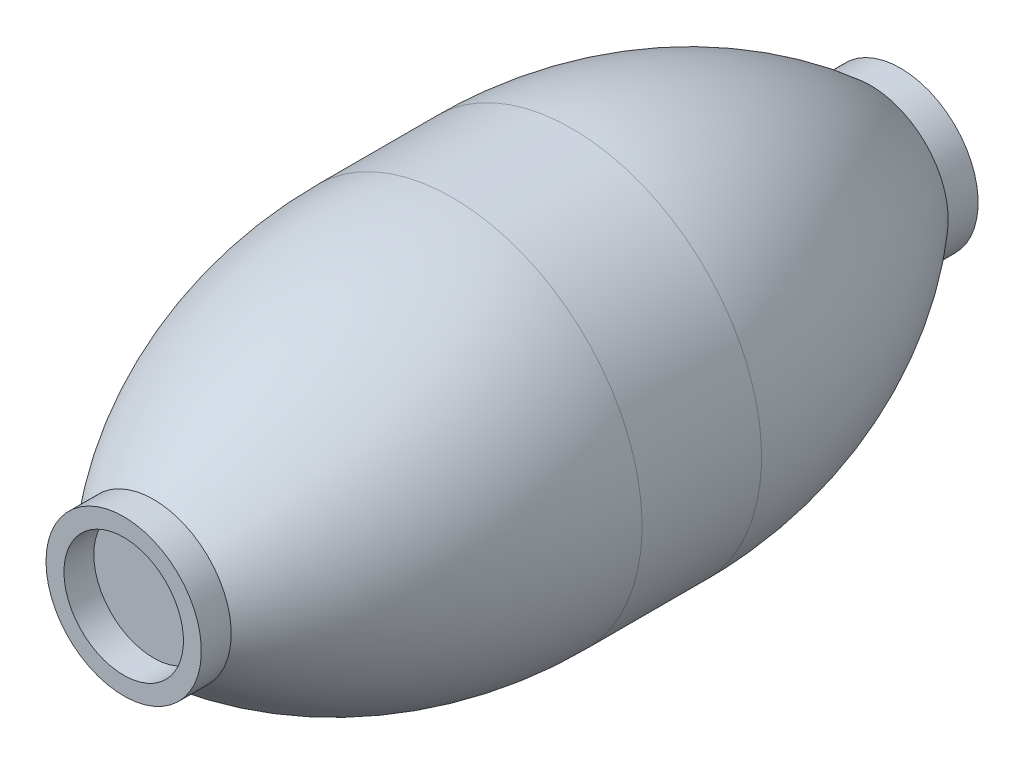
ISO-10303-21;
HEADER;
FILE_DESCRIPTION(('STEP AP214'),'2;1');
FILE_NAME('part.step','',(''),(''),'','','');
FILE_SCHEMA(('AUTOMOTIVE_DESIGN { 1 0 10303 214 1 1 1 1 }'));
ENDSEC;
DATA;
#1=APPLICATION_CONTEXT('core data for automotive mechanical design processes');
#2=APPLICATION_PROTOCOL_DEFINITION('international standard','automotive_design',2000,#1);
#3=PRODUCT_CONTEXT('',#1,'mechanical');
#4=PRODUCT('Part','Part','',(#3));
#5=PRODUCT_RELATED_PRODUCT_CATEGORY('part','',(#4));
#6=PRODUCT_DEFINITION_FORMATION('','',#4);
#7=PRODUCT_DEFINITION_CONTEXT('part definition',#1,'design');
#8=PRODUCT_DEFINITION('design','',#6,#7);
#9=PRODUCT_DEFINITION_SHAPE('','',#8);
#10=(LENGTH_UNIT() NAMED_UNIT(*) SI_UNIT(.MILLI.,.METRE.));
#11=(NAMED_UNIT(*) PLANE_ANGLE_UNIT() SI_UNIT($,.RADIAN.));
#12=(NAMED_UNIT(*) SI_UNIT($,.STERADIAN.) SOLID_ANGLE_UNIT());
#13=UNCERTAINTY_MEASURE_WITH_UNIT(LENGTH_MEASURE(1.E-05),#10,'distance_accuracy_value','');
#14=(GEOMETRIC_REPRESENTATION_CONTEXT(3) GLOBAL_UNCERTAINTY_ASSIGNED_CONTEXT((#13)) GLOBAL_UNIT_ASSIGNED_CONTEXT((#10,
#11,#12)) REPRESENTATION_CONTEXT('',''));
#15=CARTESIAN_POINT('',(0.,0.,0.));
#16=DIRECTION('',(0.,0.,1.));
#17=DIRECTION('',(1.,0.,0.));
#18=AXIS2_PLACEMENT_3D('',#15,#16,#17);
#19=CARTESIAN_POINT('',(-20.,0.,-130.));
#20=DIRECTION('',(0.,0.,-1.));
#21=DIRECTION('',(-1.,0.,0.));
#22=AXIS2_PLACEMENT_3D('',#19,#20,#21);
#23=PLANE('',#22);
#24=CARTESIAN_POINT('',(0.,0.,-130.));
#25=DIRECTION('',(0.,0.,-1.));
#26=DIRECTION('',(-1.,0.,0.));
#27=AXIS2_PLACEMENT_3D('',#24,#25,#26);
#28=CIRCLE('',#27,26.);
#29=CARTESIAN_POINT('',(-26.,0.,-130.));
#30=VERTEX_POINT('',#29);
#31=EDGE_CURVE('E10',#30,#30,#28,.T.);
#32=ORIENTED_EDGE('',*,*,#31,.T.);
#33=EDGE_LOOP('',(#32));
#34=FACE_BOUND('',#33,.T.);
#35=CARTESIAN_POINT('',(0.,0.,-130.));
#36=DIRECTION('',(0.,0.,-1.));
#37=DIRECTION('',(-1.,0.,0.));
#38=AXIS2_PLACEMENT_3D('',#35,#36,#37);
#39=CIRCLE('',#38,20.);
#40=CARTESIAN_POINT('',(-20.,0.,-130.));
#41=VERTEX_POINT('',#40);
#42=EDGE_CURVE('E66',#41,#41,#39,.T.);
#43=ORIENTED_EDGE('',*,*,#42,.F.);
#44=EDGE_LOOP('',(#43));
#45=FACE_BOUND('',#44,.T.);
#46=ADVANCED_FACE('F32',(#34,#45),#23,.T.);
#47=CARTESIAN_POINT('',(0.,0.,-130.));
#48=DIRECTION('',(0.,0.,-1.));
#49=DIRECTION('',(-1.,0.,0.));
#50=AXIS2_PLACEMENT_3D('',#47,#48,#49);
#51=CYLINDRICAL_SURFACE('',#50,26.);
#52=CARTESIAN_POINT('',(0.,0.,-120.));
#53=DIRECTION('',(0.,0.,-1.));
#54=DIRECTION('',(-1.,0.,0.));
#55=AXIS2_PLACEMENT_3D('',#52,#53,#54);
#56=CIRCLE('',#55,26.);
#57=CARTESIAN_POINT('',(-25.9999999999999,0.,-120.));
#58=VERTEX_POINT('',#57);
#59=EDGE_CURVE('E38',#58,#58,#56,.T.);
#60=ORIENTED_EDGE('',*,*,#59,.T.);
#61=EDGE_LOOP('',(#60));
#62=FACE_BOUND('',#61,.T.);
#63=ORIENTED_EDGE('',*,*,#31,.F.);
#64=EDGE_LOOP('',(#63));
#65=FACE_BOUND('',#64,.T.);
#66=ADVANCED_FACE('F74',(#62,#65),#51,.T.);
#67=CARTESIAN_POINT('',(0.,0.,-20.));
#68=DIRECTION('',(0.,0.,-1.));
#69=DIRECTION('',(-1.,0.,0.));
#70=AXIS2_PLACEMENT_3D('',#67,#68,#69);
#71=DEGENERATE_TOROIDAL_SURFACE('',#70,88.5833333333333,152.083333333333,.F.);
#72=CARTESIAN_POINT('',(0.,0.,-20.));
#73=DIRECTION('',(0.,0.,-1.));
#74=DIRECTION('',(-1.,0.,0.));
#75=AXIS2_PLACEMENT_3D('',#72,#73,#74);
#76=CIRCLE('',#75,63.5);
#77=CARTESIAN_POINT('',(-63.5,0.,-20.));
#78=VERTEX_POINT('',#77);
#79=EDGE_CURVE('E42',#78,#78,#76,.T.);
#80=ORIENTED_EDGE('',*,*,#79,.T.);
#81=EDGE_LOOP('',(#80));
#82=FACE_BOUND('',#81,.T.);
#83=ORIENTED_EDGE('',*,*,#59,.F.);
#84=EDGE_LOOP('',(#83));
#85=FACE_BOUND('',#84,.T.);
#86=ADVANCED_FACE('F78',(#82,#85),#71,.F.);
#87=CARTESIAN_POINT('',(0.,0.,-130.));
#88=DIRECTION('',(0.,0.,-1.));
#89=DIRECTION('',(-1.,0.,0.));
#90=AXIS2_PLACEMENT_3D('',#87,#88,#89);
#91=CYLINDRICAL_SURFACE('',#90,63.5);
#92=CARTESIAN_POINT('',(0.,0.,20.));
#93=DIRECTION('',(0.,0.,-1.));
#94=DIRECTION('',(-1.,0.,0.));
#95=AXIS2_PLACEMENT_3D('',#92,#93,#94);
#96=CIRCLE('',#95,63.5);
#97=CARTESIAN_POINT('',(-63.5,0.,20.));
#98=VERTEX_POINT('',#97);
#99=EDGE_CURVE('E46',#98,#98,#96,.T.);
#100=ORIENTED_EDGE('',*,*,#99,.T.);
#101=EDGE_LOOP('',(#100));
#102=FACE_BOUND('',#101,.T.);
#103=ORIENTED_EDGE('',*,*,#79,.F.);
#104=EDGE_LOOP('',(#103));
#105=FACE_BOUND('',#104,.T.);
#106=ADVANCED_FACE('F82',(#102,#105),#91,.T.);
#107=CARTESIAN_POINT('',(0.,0.,20.));
#108=DIRECTION('',(0.,0.,-1.));
#109=DIRECTION('',(-1.,0.,0.));
#110=AXIS2_PLACEMENT_3D('',#107,#108,#109);
#111=DEGENERATE_TOROIDAL_SURFACE('',#110,88.5833333333333,152.083333333333,.F.);
#112=CARTESIAN_POINT('',(0.,0.,120.));
#113=DIRECTION('',(0.,0.,-1.));
#114=DIRECTION('',(-1.,0.,0.));
#115=AXIS2_PLACEMENT_3D('',#112,#113,#114);
#116=CIRCLE('',#115,26.);
#117=CARTESIAN_POINT('',(-25.9999999999999,0.,120.));
#118=VERTEX_POINT('',#117);
#119=EDGE_CURVE('E51',#118,#118,#116,.T.);
#120=ORIENTED_EDGE('',*,*,#119,.T.);
#121=EDGE_LOOP('',(#120));
#122=FACE_BOUND('',#121,.T.);
#123=ORIENTED_EDGE('',*,*,#99,.F.);
#124=EDGE_LOOP('',(#123));
#125=FACE_BOUND('',#124,.T.);
#126=ADVANCED_FACE('F89',(#122,#125),#111,.F.);
#127=CARTESIAN_POINT('',(0.,0.,-130.));
#128=DIRECTION('',(0.,0.,-1.));
#129=DIRECTION('',(-1.,0.,0.));
#130=AXIS2_PLACEMENT_3D('',#127,#128,#129);
#131=CYLINDRICAL_SURFACE('',#130,26.);
#132=CARTESIAN_POINT('',(0.,0.,130.));
#133=DIRECTION('',(0.,0.,-1.));
#134=DIRECTION('',(-1.,0.,0.));
#135=AXIS2_PLACEMENT_3D('',#132,#133,#134);
#136=CIRCLE('',#135,26.);
#137=CARTESIAN_POINT('',(-26.,0.,130.));
#138=VERTEX_POINT('',#137);
#139=EDGE_CURVE('E54',#138,#138,#136,.T.);
#140=ORIENTED_EDGE('',*,*,#139,.T.);
#141=EDGE_LOOP('',(#140));
#142=FACE_BOUND('',#141,.T.);
#143=ORIENTED_EDGE('',*,*,#119,.F.);
#144=EDGE_LOOP('',(#143));
#145=FACE_BOUND('',#144,.T.);
#146=ADVANCED_FACE('F93',(#142,#145),#131,.T.);
#147=CARTESIAN_POINT('',(-20.,0.,130.));
#148=DIRECTION('',(0.,0.,1.));
#149=DIRECTION('',(1.,0.,0.));
#150=AXIS2_PLACEMENT_3D('',#147,#148,#149);
#151=PLANE('',#150);
#152=CARTESIAN_POINT('',(0.,0.,130.));
#153=DIRECTION('',(0.,0.,-1.));
#154=DIRECTION('',(-1.,0.,0.));
#155=AXIS2_PLACEMENT_3D('',#152,#153,#154);
#156=CIRCLE('',#155,20.);
#157=CARTESIAN_POINT('',(-20.,0.,130.));
#158=VERTEX_POINT('',#157);
#159=EDGE_CURVE('E57',#158,#158,#156,.T.);
#160=ORIENTED_EDGE('',*,*,#159,.T.);
#161=EDGE_LOOP('',(#160));
#162=FACE_BOUND('',#161,.T.);
#163=ORIENTED_EDGE('',*,*,#139,.F.);
#164=EDGE_LOOP('',(#163));
#165=FACE_BOUND('',#164,.T.);
#166=ADVANCED_FACE('F97',(#162,#165),#151,.T.);
#167=CARTESIAN_POINT('',(0.,0.,-130.));
#168=DIRECTION('',(0.,0.,-1.));
#169=DIRECTION('',(-1.,0.,0.));
#170=AXIS2_PLACEMENT_3D('',#167,#168,#169);
#171=CYLINDRICAL_SURFACE('',#170,20.);
#172=CARTESIAN_POINT('',(0.,0.,120.));
#173=DIRECTION('',(0.,0.,-1.));
#174=DIRECTION('',(-1.,0.,0.));
#175=AXIS2_PLACEMENT_3D('',#172,#173,#174);
#176=CIRCLE('',#175,20.);
#177=CARTESIAN_POINT('',(-20.,0.,120.));
#178=VERTEX_POINT('',#177);
#179=EDGE_CURVE('E60',#178,#178,#176,.T.);
#180=ORIENTED_EDGE('',*,*,#179,.T.);
#181=EDGE_LOOP('',(#180));
#182=FACE_BOUND('',#181,.T.);
#183=ORIENTED_EDGE('',*,*,#159,.F.);
#184=EDGE_LOOP('',(#183));
#185=FACE_BOUND('',#184,.T.);
#186=ADVANCED_FACE('F101',(#182,#185),#171,.F.);
#187=CARTESIAN_POINT('',(0.,0.,120.));
#188=DIRECTION('',(0.,0.,1.));
#189=DIRECTION('',(1.,0.,0.));
#190=AXIS2_PLACEMENT_3D('',#187,#188,#189);
#191=PLANE('',#190);
#192=ORIENTED_EDGE('',*,*,#179,.F.);
#193=EDGE_LOOP('',(#192));
#194=FACE_BOUND('',#193,.T.);
#195=ADVANCED_FACE('F105',(#194),#191,.T.);
#196=CARTESIAN_POINT('',(-20.,0.,-120.));
#197=DIRECTION('',(0.,0.,-1.));
#198=DIRECTION('',(-1.,0.,0.));
#199=AXIS2_PLACEMENT_3D('',#196,#197,#198);
#200=PLANE('',#199);
#201=CARTESIAN_POINT('',(0.,0.,-120.));
#202=DIRECTION('',(0.,0.,-1.));
#203=DIRECTION('',(-1.,0.,0.));
#204=AXIS2_PLACEMENT_3D('',#201,#202,#203);
#205=CIRCLE('',#204,20.);
#206=CARTESIAN_POINT('',(-20.,0.,-120.));
#207=VERTEX_POINT('',#206);
#208=EDGE_CURVE('E63',#207,#207,#205,.T.);
#209=ORIENTED_EDGE('',*,*,#208,.T.);
#210=EDGE_LOOP('',(#209));
#211=FACE_BOUND('',#210,.T.);
#212=ADVANCED_FACE('F109',(#211),#200,.T.);
#213=CARTESIAN_POINT('',(0.,0.,-130.));
#214=DIRECTION('',(0.,0.,-1.));
#215=DIRECTION('',(-1.,0.,0.));
#216=AXIS2_PLACEMENT_3D('',#213,#214,#215);
#217=CYLINDRICAL_SURFACE('',#216,20.);
#218=ORIENTED_EDGE('',*,*,#42,.T.);
#219=EDGE_LOOP('',(#218));
#220=FACE_BOUND('',#219,.T.);
#221=ORIENTED_EDGE('',*,*,#208,.F.);
#222=EDGE_LOOP('',(#221));
#223=FACE_BOUND('',#222,.T.);
#224=ADVANCED_FACE('F70',(#220,#223),#217,.F.);
#225=CLOSED_SHELL('',(#46,#66,#86,#106,#126,#146,#166,#186,#195,#212,#224));
#226=MANIFOLD_SOLID_BREP('B2',#225);
#227=ADVANCED_BREP_SHAPE_REPRESENTATION('',(#18,#226),#14);
#228=SHAPE_DEFINITION_REPRESENTATION(#9,#227);
ENDSEC;
END-ISO-10303-21;
